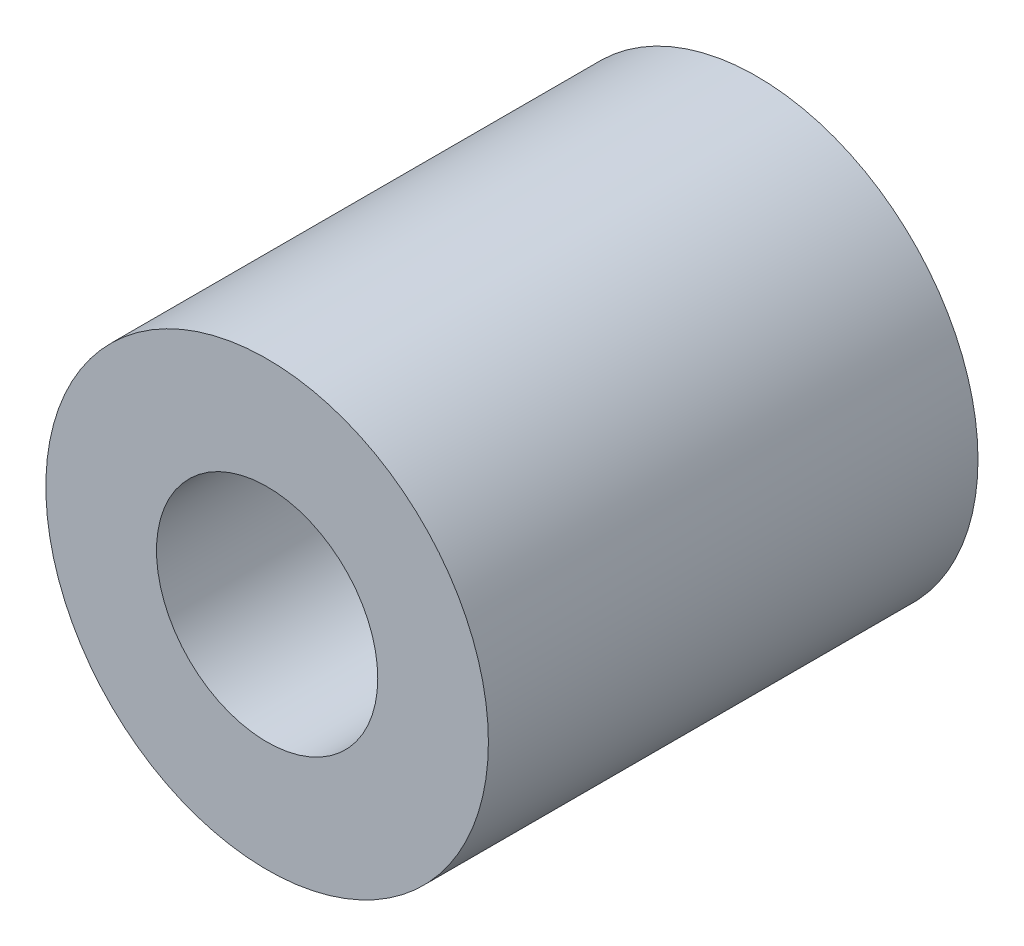
ISO-10303-21;
HEADER;
FILE_DESCRIPTION(('STEP AP214'),'2;1');
FILE_NAME('part.step','',(''),(''),'','','');
FILE_SCHEMA(('AUTOMOTIVE_DESIGN { 1 0 10303 214 1 1 1 1 }'));
ENDSEC;
DATA;
#1=APPLICATION_CONTEXT('core data for automotive mechanical design processes');
#2=APPLICATION_PROTOCOL_DEFINITION('international standard','automotive_design',2000,#1);
#3=PRODUCT_CONTEXT('',#1,'mechanical');
#4=PRODUCT('Part','Part','',(#3));
#5=PRODUCT_RELATED_PRODUCT_CATEGORY('part','',(#4));
#6=PRODUCT_DEFINITION_FORMATION('','',#4);
#7=PRODUCT_DEFINITION_CONTEXT('part definition',#1,'design');
#8=PRODUCT_DEFINITION('design','',#6,#7);
#9=PRODUCT_DEFINITION_SHAPE('','',#8);
#10=(LENGTH_UNIT() NAMED_UNIT(*) SI_UNIT(.MILLI.,.METRE.));
#11=(NAMED_UNIT(*) PLANE_ANGLE_UNIT() SI_UNIT($,.RADIAN.));
#12=(NAMED_UNIT(*) SI_UNIT($,.STERADIAN.) SOLID_ANGLE_UNIT());
#13=UNCERTAINTY_MEASURE_WITH_UNIT(LENGTH_MEASURE(1.E-05),#10,'distance_accuracy_value','');
#14=(GEOMETRIC_REPRESENTATION_CONTEXT(3) GLOBAL_UNCERTAINTY_ASSIGNED_CONTEXT((#13)) GLOBAL_UNIT_ASSIGNED_CONTEXT((#10,
#11,#12)) REPRESENTATION_CONTEXT('',''));
#15=CARTESIAN_POINT('',(0.,0.,0.));
#16=DIRECTION('',(0.,0.,1.));
#17=DIRECTION('',(1.,0.,0.));
#18=AXIS2_PLACEMENT_3D('',#15,#16,#17);
#19=CARTESIAN_POINT('',(0.,0.,-7.025));
#20=DIRECTION('',(0.,0.,1.));
#21=DIRECTION('',(1.,0.,0.));
#22=AXIS2_PLACEMENT_3D('',#19,#20,#21);
#23=CYLINDRICAL_SURFACE('',#22,6.35);
#24=CARTESIAN_POINT('',(0.,0.,-7.025));
#25=DIRECTION('',(0.,0.,1.));
#26=DIRECTION('',(1.,0.,0.));
#27=AXIS2_PLACEMENT_3D('',#24,#25,#26);
#28=CIRCLE('',#27,6.35);
#29=CARTESIAN_POINT('',(6.35,0.,-7.025));
#30=VERTEX_POINT('',#29);
#31=EDGE_CURVE('E10',#30,#30,#28,.T.);
#32=ORIENTED_EDGE('',*,*,#31,.T.);
#33=EDGE_LOOP('',(#32));
#34=FACE_BOUND('',#33,.T.);
#35=CARTESIAN_POINT('',(0.,0.,7.025));
#36=DIRECTION('',(0.,0.,1.));
#37=DIRECTION('',(1.,0.,0.));
#38=AXIS2_PLACEMENT_3D('',#35,#36,#37);
#39=CIRCLE('',#38,6.35);
#40=CARTESIAN_POINT('',(6.35,0.,7.025));
#41=VERTEX_POINT('',#40);
#42=EDGE_CURVE('E38',#41,#41,#39,.T.);
#43=ORIENTED_EDGE('',*,*,#42,.F.);
#44=EDGE_LOOP('',(#43));
#45=FACE_BOUND('',#44,.T.);
#46=ADVANCED_FACE('F32',(#34,#45),#23,.T.);
#47=CARTESIAN_POINT('',(0.,0.,-7.025));
#48=DIRECTION('',(0.,0.,1.));
#49=DIRECTION('',(1.,0.,0.));
#50=AXIS2_PLACEMENT_3D('',#47,#48,#49);
#51=PLANE('',#50);
#52=CARTESIAN_POINT('',(0.,0.,-7.025));
#53=DIRECTION('',(0.,0.,1.));
#54=DIRECTION('',(1.,0.,0.));
#55=AXIS2_PLACEMENT_3D('',#52,#53,#54);
#56=CIRCLE('',#55,3.175);
#57=CARTESIAN_POINT('',(3.175,0.,-7.025));
#58=VERTEX_POINT('',#57);
#59=EDGE_CURVE('E42',#58,#58,#56,.T.);
#60=ORIENTED_EDGE('',*,*,#59,.T.);
#61=EDGE_LOOP('',(#60));
#62=FACE_BOUND('',#61,.T.);
#63=ORIENTED_EDGE('',*,*,#31,.F.);
#64=EDGE_LOOP('',(#63));
#65=FACE_BOUND('',#64,.T.);
#66=ADVANCED_FACE('F56',(#62,#65),#51,.F.);
#67=CARTESIAN_POINT('',(0.,0.,7.025));
#68=DIRECTION('',(0.,0.,1.));
#69=DIRECTION('',(1.,0.,0.));
#70=AXIS2_PLACEMENT_3D('',#67,#68,#69);
#71=PLANE('',#70);
#72=CARTESIAN_POINT('',(0.,0.,7.025));
#73=DIRECTION('',(0.,0.,1.));
#74=DIRECTION('',(1.,0.,0.));
#75=AXIS2_PLACEMENT_3D('',#72,#73,#74);
#76=CIRCLE('',#75,3.175);
#77=CARTESIAN_POINT('',(3.175,0.,7.025));
#78=VERTEX_POINT('',#77);
#79=EDGE_CURVE('E46',#78,#78,#76,.T.);
#80=ORIENTED_EDGE('',*,*,#79,.F.);
#81=EDGE_LOOP('',(#80));
#82=FACE_BOUND('',#81,.T.);
#83=ORIENTED_EDGE('',*,*,#42,.T.);
#84=EDGE_LOOP('',(#83));
#85=FACE_BOUND('',#84,.T.);
#86=ADVANCED_FACE('F54',(#82,#85),#71,.T.);
#87=CARTESIAN_POINT('',(0.,0.,-7.025));
#88=DIRECTION('',(0.,0.,1.));
#89=DIRECTION('',(1.,0.,0.));
#90=AXIS2_PLACEMENT_3D('',#87,#88,#89);
#91=CYLINDRICAL_SURFACE('',#90,3.175);
#92=ORIENTED_EDGE('',*,*,#59,.F.);
#93=EDGE_LOOP('',(#92));
#94=FACE_BOUND('',#93,.T.);
#95=ORIENTED_EDGE('',*,*,#79,.T.);
#96=EDGE_LOOP('',(#95));
#97=FACE_BOUND('',#96,.T.);
#98=ADVANCED_FACE('F52',(#94,#97),#91,.F.);
#99=CLOSED_SHELL('',(#46,#66,#86,#98));
#100=MANIFOLD_SOLID_BREP('B2',#99);
#101=ADVANCED_BREP_SHAPE_REPRESENTATION('',(#18,#100),#14);
#102=SHAPE_DEFINITION_REPRESENTATION(#9,#101);
ENDSEC;
END-ISO-10303-21;
